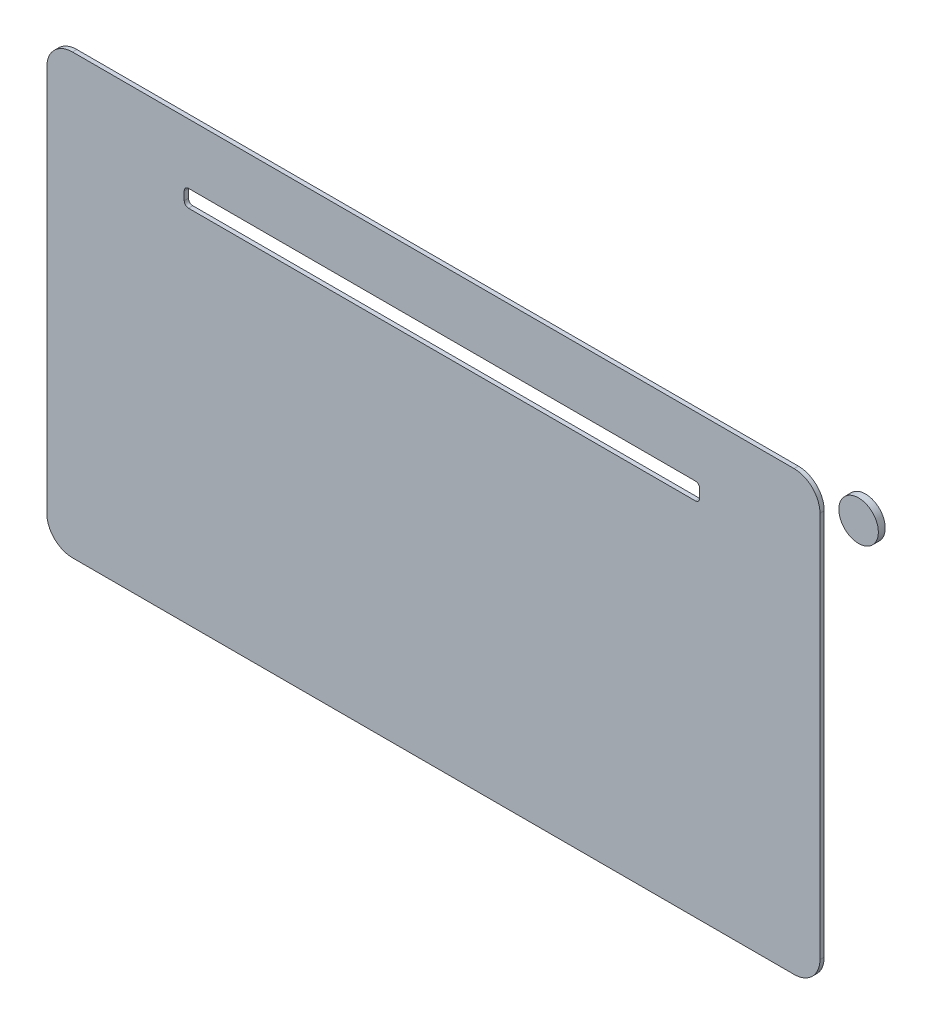
ISO-10303-21;
HEADER;
FILE_DESCRIPTION(('STEP AP214'),'2;1');
FILE_NAME('part.step','',(''),(''),'','','');
FILE_SCHEMA(('AUTOMOTIVE_DESIGN { 1 0 10303 214 1 1 1 1 }'));
ENDSEC;
DATA;
#1=APPLICATION_CONTEXT('core data for automotive mechanical design processes');
#2=APPLICATION_PROTOCOL_DEFINITION('international standard','automotive_design',2000,#1);
#3=PRODUCT_CONTEXT('',#1,'mechanical');
#4=PRODUCT('Part','Part','',(#3));
#5=PRODUCT_RELATED_PRODUCT_CATEGORY('part','',(#4));
#6=PRODUCT_DEFINITION_FORMATION('','',#4);
#7=PRODUCT_DEFINITION_CONTEXT('part definition',#1,'design');
#8=PRODUCT_DEFINITION('design','',#6,#7);
#9=PRODUCT_DEFINITION_SHAPE('','',#8);
#10=(LENGTH_UNIT() NAMED_UNIT(*) SI_UNIT(.MILLI.,.METRE.));
#11=(NAMED_UNIT(*) PLANE_ANGLE_UNIT() SI_UNIT($,.RADIAN.));
#12=(NAMED_UNIT(*) SI_UNIT($,.STERADIAN.) SOLID_ANGLE_UNIT());
#13=UNCERTAINTY_MEASURE_WITH_UNIT(LENGTH_MEASURE(1.E-05),#10,'distance_accuracy_value','');
#14=(GEOMETRIC_REPRESENTATION_CONTEXT(3) GLOBAL_UNCERTAINTY_ASSIGNED_CONTEXT((#13)) GLOBAL_UNIT_ASSIGNED_CONTEXT((#10,
#11,#12)) REPRESENTATION_CONTEXT('',''));
#15=CARTESIAN_POINT('',(0.,0.,0.));
#16=DIRECTION('',(0.,0.,1.));
#17=DIRECTION('',(1.,0.,0.));
#18=AXIS2_PLACEMENT_3D('',#15,#16,#17);
#19=CARTESIAN_POINT('',(132.5,61.5,0.));
#20=DIRECTION('',(0.,0.,-1.));
#21=DIRECTION('',(-1.,0.,0.));
#22=AXIS2_PLACEMENT_3D('',#19,#20,#21);
#23=CYLINDRICAL_SURFACE('',#22,2.3);
#24=CARTESIAN_POINT('',(132.5,61.5,0.));
#25=DIRECTION('',(0.,0.,1.));
#26=DIRECTION('',(1.,0.,0.));
#27=AXIS2_PLACEMENT_3D('',#24,#25,#26);
#28=CIRCLE('',#27,2.3);
#29=CARTESIAN_POINT('',(134.8,61.5,0.));
#30=VERTEX_POINT('',#29);
#31=EDGE_CURVE('E11',#30,#30,#28,.T.);
#32=ORIENTED_EDGE('',*,*,#31,.F.);
#33=EDGE_LOOP('',(#32));
#34=FACE_BOUND('',#33,.T.);
#35=CARTESIAN_POINT('',(132.5,61.5,-0.8));
#36=DIRECTION('',(0.,0.,1.));
#37=DIRECTION('',(1.,0.,0.));
#38=AXIS2_PLACEMENT_3D('',#35,#36,#37);
#39=CIRCLE('',#38,2.3);
#40=CARTESIAN_POINT('',(134.8,61.5,-0.8));
#41=VERTEX_POINT('',#40);
#42=EDGE_CURVE('E55',#41,#41,#39,.T.);
#43=ORIENTED_EDGE('',*,*,#42,.T.);
#44=EDGE_LOOP('',(#43));
#45=FACE_BOUND('',#44,.T.);
#46=ADVANCED_FACE('F47',(#34,#45),#23,.T.);
#47=CARTESIAN_POINT('',(132.5,61.5,0.));
#48=DIRECTION('',(0.,0.,1.));
#49=DIRECTION('',(1.,0.,0.));
#50=AXIS2_PLACEMENT_3D('',#47,#48,#49);
#51=PLANE('',#50);
#52=ORIENTED_EDGE('',*,*,#31,.T.);
#53=EDGE_LOOP('',(#52));
#54=FACE_BOUND('',#53,.T.);
#55=ADVANCED_FACE('F65',(#54),#51,.T.);
#56=CARTESIAN_POINT('',(132.5,61.5,-0.8));
#57=DIRECTION('',(0.,0.,1.));
#58=DIRECTION('',(1.,0.,0.));
#59=AXIS2_PLACEMENT_3D('',#56,#57,#58);
#60=PLANE('',#59);
#61=ORIENTED_EDGE('',*,*,#42,.F.);
#62=EDGE_LOOP('',(#61));
#63=FACE_BOUND('',#62,.T.);
#64=ADVANCED_FACE('F64',(#63),#60,.F.);
#65=CLOSED_SHELL('',(#46,#55,#64));
#66=MANIFOLD_SOLID_BREP('B2',#65);
#67=CARTESIAN_POINT('',(41.,15.,0.));
#68=DIRECTION('',(0.,0.,-1.));
#69=DIRECTION('',(-1.,0.,0.));
#70=AXIS2_PLACEMENT_3D('',#67,#68,#69);
#71=CYLINDRICAL_SURFACE('',#70,3.);
#72=CARTESIAN_POINT('',(41.,15.,-0.5));
#73=DIRECTION('',(0.,0.,1.));
#74=DIRECTION('',(1.,0.,0.));
#75=AXIS2_PLACEMENT_3D('',#72,#73,#74);
#76=CIRCLE('',#75,3.);
#77=CARTESIAN_POINT('',(38.,15.,-0.5));
#78=VERTEX_POINT('',#77);
#79=CARTESIAN_POINT('',(41.,12.,-0.5));
#80=VERTEX_POINT('',#79);
#81=EDGE_CURVE('E266',#78,#80,#76,.T.);
#82=ORIENTED_EDGE('',*,*,#81,.T.);
#83=DIRECTION('',(0.,0.,-1.));
#84=VECTOR('',#83,1.);
#85=CARTESIAN_POINT('',(41.,12.,0.));
#86=LINE('',#85,#84);
#87=CARTESIAN_POINT('',(41.,12.,0.));
#88=VERTEX_POINT('',#87);
#89=EDGE_CURVE('E50',#88,#80,#86,.T.);
#90=ORIENTED_EDGE('',*,*,#89,.F.);
#91=CARTESIAN_POINT('',(41.,15.,0.));
#92=DIRECTION('',(0.,0.,1.));
#93=DIRECTION('',(1.,0.,0.));
#94=AXIS2_PLACEMENT_3D('',#91,#92,#93);
#95=CIRCLE('',#94,3.);
#96=CARTESIAN_POINT('',(38.,15.,0.));
#97=VERTEX_POINT('',#96);
#98=EDGE_CURVE('E270',#97,#88,#95,.T.);
#99=ORIENTED_EDGE('',*,*,#98,.F.);
#100=DIRECTION('',(0.,0.,-1.));
#101=VECTOR('',#100,1.);
#102=CARTESIAN_POINT('',(38.,15.,0.));
#103=LINE('',#102,#101);
#104=EDGE_CURVE('E284',#97,#78,#103,.T.);
#105=ORIENTED_EDGE('',*,*,#104,.T.);
#106=EDGE_LOOP('',(#82,#90,#99,#105));
#107=FACE_BOUND('',#106,.T.);
#108=ADVANCED_FACE('F89',(#107),#71,.T.);
#109=CARTESIAN_POINT('',(41.,12.,0.));
#110=DIRECTION('',(0.,1.,0.));
#111=DIRECTION('',(0.,0.,1.));
#112=AXIS2_PLACEMENT_3D('',#109,#110,#111);
#113=PLANE('',#112);
#114=DIRECTION('',(1.,0.,0.));
#115=VECTOR('',#114,1.);
#116=CARTESIAN_POINT('',(41.,12.,-0.5));
#117=LINE('',#116,#115);
#118=CARTESIAN_POINT('',(125.,12.,-0.5));
#119=VERTEX_POINT('',#118);
#120=EDGE_CURVE('E287',#80,#119,#117,.T.);
#121=ORIENTED_EDGE('',*,*,#120,.T.);
#122=DIRECTION('',(0.,0.,-1.));
#123=VECTOR('',#122,1.);
#124=CARTESIAN_POINT('',(125.,12.,0.));
#125=LINE('',#124,#123);
#126=CARTESIAN_POINT('',(125.,12.,0.));
#127=VERTEX_POINT('',#126);
#128=EDGE_CURVE('E97',#127,#119,#125,.T.);
#129=ORIENTED_EDGE('',*,*,#128,.F.);
#130=DIRECTION('',(1.,0.,0.));
#131=VECTOR('',#130,1.);
#132=CARTESIAN_POINT('',(41.,12.,0.));
#133=LINE('',#132,#131);
#134=EDGE_CURVE('E269',#88,#127,#133,.T.);
#135=ORIENTED_EDGE('',*,*,#134,.F.);
#136=ORIENTED_EDGE('',*,*,#89,.T.);
#137=EDGE_LOOP('',(#121,#129,#135,#136));
#138=FACE_BOUND('',#137,.T.);
#139=ADVANCED_FACE('F342',(#138),#113,.F.);
#140=CARTESIAN_POINT('',(125.,15.,0.));
#141=DIRECTION('',(0.,0.,-1.));
#142=DIRECTION('',(-1.,0.,0.));
#143=AXIS2_PLACEMENT_3D('',#140,#141,#142);
#144=CYLINDRICAL_SURFACE('',#143,3.);
#145=CARTESIAN_POINT('',(125.,15.,-0.5));
#146=DIRECTION('',(0.,0.,1.));
#147=DIRECTION('',(1.,0.,0.));
#148=AXIS2_PLACEMENT_3D('',#145,#146,#147);
#149=CIRCLE('',#148,3.);
#150=CARTESIAN_POINT('',(128.,15.,-0.5));
#151=VERTEX_POINT('',#150);
#152=EDGE_CURVE('E289',#119,#151,#149,.T.);
#153=ORIENTED_EDGE('',*,*,#152,.T.);
#154=DIRECTION('',(0.,0.,-1.));
#155=VECTOR('',#154,1.);
#156=CARTESIAN_POINT('',(128.,15.,0.));
#157=LINE('',#156,#155);
#158=CARTESIAN_POINT('',(128.,15.,0.));
#159=VERTEX_POINT('',#158);
#160=EDGE_CURVE('E314',#159,#151,#157,.T.);
#161=ORIENTED_EDGE('',*,*,#160,.F.);
#162=CARTESIAN_POINT('',(125.,15.,0.));
#163=DIRECTION('',(0.,0.,1.));
#164=DIRECTION('',(1.,0.,0.));
#165=AXIS2_PLACEMENT_3D('',#162,#163,#164);
#166=CIRCLE('',#165,3.);
#167=EDGE_CURVE('E271',#127,#159,#166,.T.);
#168=ORIENTED_EDGE('',*,*,#167,.F.);
#169=ORIENTED_EDGE('',*,*,#128,.T.);
#170=EDGE_LOOP('',(#153,#161,#168,#169));
#171=FACE_BOUND('',#170,.T.);
#172=ADVANCED_FACE('F324',(#171),#144,.T.);
#173=CARTESIAN_POINT('',(128.,15.,0.));
#174=DIRECTION('',(-1.,0.,0.));
#175=DIRECTION('',(0.,0.,1.));
#176=AXIS2_PLACEMENT_3D('',#173,#174,#175);
#177=PLANE('',#176);
#178=DIRECTION('',(0.,1.,0.));
#179=VECTOR('',#178,1.);
#180=CARTESIAN_POINT('',(128.,15.,-0.5));
#181=LINE('',#180,#179);
#182=CARTESIAN_POINT('',(128.,60.,-0.5));
#183=VERTEX_POINT('',#182);
#184=EDGE_CURVE('E292',#151,#183,#181,.T.);
#185=ORIENTED_EDGE('',*,*,#184,.T.);
#186=DIRECTION('',(0.,0.,-1.));
#187=VECTOR('',#186,1.);
#188=CARTESIAN_POINT('',(128.,60.,0.));
#189=LINE('',#188,#187);
#190=CARTESIAN_POINT('',(128.,60.,0.));
#191=VERTEX_POINT('',#190);
#192=EDGE_CURVE('E315',#191,#183,#189,.T.);
#193=ORIENTED_EDGE('',*,*,#192,.F.);
#194=DIRECTION('',(0.,1.,0.));
#195=VECTOR('',#194,1.);
#196=CARTESIAN_POINT('',(128.,15.,0.));
#197=LINE('',#196,#195);
#198=EDGE_CURVE('E273',#159,#191,#197,.T.);
#199=ORIENTED_EDGE('',*,*,#198,.F.);
#200=ORIENTED_EDGE('',*,*,#160,.T.);
#201=EDGE_LOOP('',(#185,#193,#199,#200));
#202=FACE_BOUND('',#201,.T.);
#203=ADVANCED_FACE('F331',(#202),#177,.F.);
#204=CARTESIAN_POINT('',(125.,60.,0.));
#205=DIRECTION('',(0.,0.,-1.));
#206=DIRECTION('',(-1.,0.,0.));
#207=AXIS2_PLACEMENT_3D('',#204,#205,#206);
#208=CYLINDRICAL_SURFACE('',#207,3.);
#209=CARTESIAN_POINT('',(125.,60.,-0.5));
#210=DIRECTION('',(0.,0.,1.));
#211=DIRECTION('',(1.,0.,0.));
#212=AXIS2_PLACEMENT_3D('',#209,#210,#211);
#213=CIRCLE('',#212,3.);
#214=CARTESIAN_POINT('',(125.,63.,-0.5));
#215=VERTEX_POINT('',#214);
#216=EDGE_CURVE('E295',#183,#215,#213,.T.);
#217=ORIENTED_EDGE('',*,*,#216,.T.);
#218=DIRECTION('',(0.,0.,-1.));
#219=VECTOR('',#218,1.);
#220=CARTESIAN_POINT('',(125.,63.,0.));
#221=LINE('',#220,#219);
#222=CARTESIAN_POINT('',(125.,63.,0.));
#223=VERTEX_POINT('',#222);
#224=EDGE_CURVE('E307',#223,#215,#221,.T.);
#225=ORIENTED_EDGE('',*,*,#224,.F.);
#226=CARTESIAN_POINT('',(125.,60.,0.));
#227=DIRECTION('',(0.,0.,1.));
#228=DIRECTION('',(1.,0.,0.));
#229=AXIS2_PLACEMENT_3D('',#226,#227,#228);
#230=CIRCLE('',#229,3.);
#231=EDGE_CURVE('E279',#191,#223,#230,.T.);
#232=ORIENTED_EDGE('',*,*,#231,.F.);
#233=ORIENTED_EDGE('',*,*,#192,.T.);
#234=EDGE_LOOP('',(#217,#225,#232,#233));
#235=FACE_BOUND('',#234,.T.);
#236=ADVANCED_FACE('F334',(#235),#208,.T.);
#237=CARTESIAN_POINT('',(125.,63.,0.));
#238=DIRECTION('',(0.,-1.,0.));
#239=DIRECTION('',(0.,0.,-1.));
#240=AXIS2_PLACEMENT_3D('',#237,#238,#239);
#241=PLANE('',#240);
#242=DIRECTION('',(-1.,0.,0.));
#243=VECTOR('',#242,1.);
#244=CARTESIAN_POINT('',(125.,63.,-0.5));
#245=LINE('',#244,#243);
#246=CARTESIAN_POINT('',(41.,63.,-0.5));
#247=VERTEX_POINT('',#246);
#248=EDGE_CURVE('E298',#215,#247,#245,.T.);
#249=ORIENTED_EDGE('',*,*,#248,.T.);
#250=DIRECTION('',(0.,0.,-1.));
#251=VECTOR('',#250,1.);
#252=CARTESIAN_POINT('',(41.,63.,0.));
#253=LINE('',#252,#251);
#254=CARTESIAN_POINT('',(41.,63.,0.));
#255=VERTEX_POINT('',#254);
#256=EDGE_CURVE('E306',#255,#247,#253,.T.);
#257=ORIENTED_EDGE('',*,*,#256,.F.);
#258=DIRECTION('',(-1.,0.,0.));
#259=VECTOR('',#258,1.);
#260=CARTESIAN_POINT('',(125.,63.,0.));
#261=LINE('',#260,#259);
#262=EDGE_CURVE('E280',#223,#255,#261,.T.);
#263=ORIENTED_EDGE('',*,*,#262,.F.);
#264=ORIENTED_EDGE('',*,*,#224,.T.);
#265=EDGE_LOOP('',(#249,#257,#263,#264));
#266=FACE_BOUND('',#265,.T.);
#267=ADVANCED_FACE('F358',(#266),#241,.F.);
#268=CARTESIAN_POINT('',(41.,60.,0.));
#269=DIRECTION('',(0.,0.,-1.));
#270=DIRECTION('',(-1.,0.,0.));
#271=AXIS2_PLACEMENT_3D('',#268,#269,#270);
#272=CYLINDRICAL_SURFACE('',#271,3.);
#273=CARTESIAN_POINT('',(41.,60.,-0.5));
#274=DIRECTION('',(0.,0.,1.));
#275=DIRECTION('',(1.,0.,0.));
#276=AXIS2_PLACEMENT_3D('',#273,#274,#275);
#277=CIRCLE('',#276,3.);
#278=CARTESIAN_POINT('',(38.,60.,-0.5));
#279=VERTEX_POINT('',#278);
#280=EDGE_CURVE('E296',#247,#279,#277,.T.);
#281=ORIENTED_EDGE('',*,*,#280,.T.);
#282=DIRECTION('',(0.,0.,-1.));
#283=VECTOR('',#282,1.);
#284=CARTESIAN_POINT('',(38.,60.,0.));
#285=LINE('',#284,#283);
#286=CARTESIAN_POINT('',(38.,60.,0.));
#287=VERTEX_POINT('',#286);
#288=EDGE_CURVE('E303',#287,#279,#285,.T.);
#289=ORIENTED_EDGE('',*,*,#288,.F.);
#290=CARTESIAN_POINT('',(41.,60.,0.));
#291=DIRECTION('',(0.,0.,1.));
#292=DIRECTION('',(1.,0.,0.));
#293=AXIS2_PLACEMENT_3D('',#290,#291,#292);
#294=CIRCLE('',#293,3.);
#295=EDGE_CURVE('E283',#255,#287,#294,.T.);
#296=ORIENTED_EDGE('',*,*,#295,.F.);
#297=ORIENTED_EDGE('',*,*,#256,.T.);
#298=EDGE_LOOP('',(#281,#289,#296,#297));
#299=FACE_BOUND('',#298,.T.);
#300=ADVANCED_FACE('F353',(#299),#272,.T.);
#301=CARTESIAN_POINT('',(38.,60.,0.));
#302=DIRECTION('',(1.,0.,0.));
#303=DIRECTION('',(0.,0.,-1.));
#304=AXIS2_PLACEMENT_3D('',#301,#302,#303);
#305=PLANE('',#304);
#306=DIRECTION('',(0.,-1.,0.));
#307=VECTOR('',#306,1.);
#308=CARTESIAN_POINT('',(38.,60.,-0.5));
#309=LINE('',#308,#307);
#310=EDGE_CURVE('E272',#279,#78,#309,.T.);
#311=ORIENTED_EDGE('',*,*,#310,.T.);
#312=ORIENTED_EDGE('',*,*,#104,.F.);
#313=DIRECTION('',(0.,-1.,0.));
#314=VECTOR('',#313,1.);
#315=CARTESIAN_POINT('',(38.,60.,0.));
#316=LINE('',#315,#314);
#317=EDGE_CURVE('E281',#287,#97,#316,.T.);
#318=ORIENTED_EDGE('',*,*,#317,.F.);
#319=ORIENTED_EDGE('',*,*,#288,.T.);
#320=EDGE_LOOP('',(#311,#312,#318,#319));
#321=FACE_BOUND('',#320,.T.);
#322=ADVANCED_FACE('F347',(#321),#305,.F.);
#323=CARTESIAN_POINT('',(41.,15.,0.));
#324=DIRECTION('',(0.,0.,1.));
#325=DIRECTION('',(1.,0.,0.));
#326=AXIS2_PLACEMENT_3D('',#323,#324,#325);
#327=PLANE('',#326);
#328=CARTESIAN_POINT('',(113.5,54.5,0.));
#329=DIRECTION('',(0.,0.,1.));
#330=DIRECTION('',(1.,0.,0.));
#331=AXIS2_PLACEMENT_3D('',#328,#329,#330);
#332=CIRCLE('',#331,0.5);
#333=CARTESIAN_POINT('',(113.5,54.,0.));
#334=VERTEX_POINT('',#333);
#335=CARTESIAN_POINT('',(114.,54.5,0.));
#336=VERTEX_POINT('',#335);
#337=EDGE_CURVE('E262',#334,#336,#332,.T.);
#338=ORIENTED_EDGE('',*,*,#337,.F.);
#339=DIRECTION('',(1.,0.,0.));
#340=VECTOR('',#339,1.);
#341=CARTESIAN_POINT('',(41.,54.,0.));
#342=LINE('',#341,#340);
#343=CARTESIAN_POINT('',(54.5,54.,0.));
#344=VERTEX_POINT('',#343);
#345=EDGE_CURVE('E241',#344,#334,#342,.T.);
#346=ORIENTED_EDGE('',*,*,#345,.F.);
#347=CARTESIAN_POINT('',(54.5,54.5,0.));
#348=DIRECTION('',(0.,0.,1.));
#349=DIRECTION('',(1.,0.,0.));
#350=AXIS2_PLACEMENT_3D('',#347,#348,#349);
#351=CIRCLE('',#350,0.5);
#352=CARTESIAN_POINT('',(54.,54.5,0.));
#353=VERTEX_POINT('',#352);
#354=EDGE_CURVE('E206',#353,#344,#351,.T.);
#355=ORIENTED_EDGE('',*,*,#354,.F.);
#356=DIRECTION('',(0.,-1.,0.));
#357=VECTOR('',#356,1.);
#358=CARTESIAN_POINT('',(54.,15.,0.));
#359=LINE('',#358,#357);
#360=CARTESIAN_POINT('',(54.,55.5,0.));
#361=VERTEX_POINT('',#360);
#362=EDGE_CURVE('E251',#361,#353,#359,.T.);
#363=ORIENTED_EDGE('',*,*,#362,.F.);
#364=CARTESIAN_POINT('',(54.5,55.5,0.));
#365=DIRECTION('',(0.,0.,1.));
#366=DIRECTION('',(1.,0.,0.));
#367=AXIS2_PLACEMENT_3D('',#364,#365,#366);
#368=CIRCLE('',#367,0.5);
#369=CARTESIAN_POINT('',(54.5,56.,0.));
#370=VERTEX_POINT('',#369);
#371=EDGE_CURVE('E258',#370,#361,#368,.T.);
#372=ORIENTED_EDGE('',*,*,#371,.F.);
#373=DIRECTION('',(-1.,0.,0.));
#374=VECTOR('',#373,1.);
#375=CARTESIAN_POINT('',(41.,56.,0.));
#376=LINE('',#375,#374);
#377=CARTESIAN_POINT('',(113.5,56.,0.));
#378=VERTEX_POINT('',#377);
#379=EDGE_CURVE('E257',#378,#370,#376,.T.);
#380=ORIENTED_EDGE('',*,*,#379,.F.);
#381=CARTESIAN_POINT('',(113.5,55.5,0.));
#382=DIRECTION('',(0.,0.,1.));
#383=DIRECTION('',(1.,0.,0.));
#384=AXIS2_PLACEMENT_3D('',#381,#382,#383);
#385=CIRCLE('',#384,0.5);
#386=CARTESIAN_POINT('',(114.,55.5,0.));
#387=VERTEX_POINT('',#386);
#388=EDGE_CURVE('E256',#387,#378,#385,.T.);
#389=ORIENTED_EDGE('',*,*,#388,.F.);
#390=DIRECTION('',(0.,1.,0.));
#391=VECTOR('',#390,1.);
#392=CARTESIAN_POINT('',(114.,15.,0.));
#393=LINE('',#392,#391);
#394=EDGE_CURVE('E265',#336,#387,#393,.T.);
#395=ORIENTED_EDGE('',*,*,#394,.F.);
#396=EDGE_LOOP('',(#338,#346,#355,#363,#372,#380,#389,#395));
#397=FACE_BOUND('',#396,.T.);
#398=ORIENTED_EDGE('',*,*,#98,.T.);
#399=ORIENTED_EDGE('',*,*,#134,.T.);
#400=ORIENTED_EDGE('',*,*,#167,.T.);
#401=ORIENTED_EDGE('',*,*,#198,.T.);
#402=ORIENTED_EDGE('',*,*,#231,.T.);
#403=ORIENTED_EDGE('',*,*,#262,.T.);
#404=ORIENTED_EDGE('',*,*,#295,.T.);
#405=ORIENTED_EDGE('',*,*,#317,.T.);
#406=EDGE_LOOP('',(#398,#399,#400,#401,#402,#403,#404,#405));
#407=FACE_BOUND('',#406,.T.);
#408=ADVANCED_FACE('F339',(#397,#407),#327,.T.);
#409=CARTESIAN_POINT('',(41.,15.,-0.5));
#410=DIRECTION('',(0.,0.,1.));
#411=DIRECTION('',(1.,0.,0.));
#412=AXIS2_PLACEMENT_3D('',#409,#410,#411);
#413=PLANE('',#412);
#414=DIRECTION('',(-1.,0.,0.));
#415=VECTOR('',#414,1.);
#416=CARTESIAN_POINT('',(113.5,54.,-0.5));
#417=LINE('',#416,#415);
#418=CARTESIAN_POINT('',(113.5,54.,-0.5));
#419=VERTEX_POINT('',#418);
#420=CARTESIAN_POINT('',(54.5,54.,-0.5));
#421=VERTEX_POINT('',#420);
#422=EDGE_CURVE('E215',#419,#421,#417,.T.);
#423=ORIENTED_EDGE('',*,*,#422,.F.);
#424=CARTESIAN_POINT('',(113.5,54.5,-0.5));
#425=DIRECTION('',(0.,0.,-1.));
#426=DIRECTION('',(-1.,0.,0.));
#427=AXIS2_PLACEMENT_3D('',#424,#425,#426);
#428=CIRCLE('',#427,0.5);
#429=CARTESIAN_POINT('',(114.,54.5,-0.5));
#430=VERTEX_POINT('',#429);
#431=EDGE_CURVE('E115',#430,#419,#428,.T.);
#432=ORIENTED_EDGE('',*,*,#431,.F.);
#433=DIRECTION('',(0.,-1.,0.));
#434=VECTOR('',#433,1.);
#435=CARTESIAN_POINT('',(114.,55.5,-0.5));
#436=LINE('',#435,#434);
#437=CARTESIAN_POINT('',(114.,55.5,-0.5));
#438=VERTEX_POINT('',#437);
#439=EDGE_CURVE('E236',#438,#430,#436,.T.);
#440=ORIENTED_EDGE('',*,*,#439,.F.);
#441=CARTESIAN_POINT('',(113.5,55.5,-0.5));
#442=DIRECTION('',(0.,0.,-1.));
#443=DIRECTION('',(-1.,0.,0.));
#444=AXIS2_PLACEMENT_3D('',#441,#442,#443);
#445=CIRCLE('',#444,0.5);
#446=CARTESIAN_POINT('',(113.5,56.,-0.5));
#447=VERTEX_POINT('',#446);
#448=EDGE_CURVE('E231',#447,#438,#445,.T.);
#449=ORIENTED_EDGE('',*,*,#448,.F.);
#450=DIRECTION('',(1.,0.,0.));
#451=VECTOR('',#450,1.);
#452=CARTESIAN_POINT('',(54.5,56.,-0.5));
#453=LINE('',#452,#451);
#454=CARTESIAN_POINT('',(54.5,56.,-0.5));
#455=VERTEX_POINT('',#454);
#456=EDGE_CURVE('E229',#455,#447,#453,.T.);
#457=ORIENTED_EDGE('',*,*,#456,.F.);
#458=CARTESIAN_POINT('',(54.5,55.5,-0.5));
#459=DIRECTION('',(0.,0.,-1.));
#460=DIRECTION('',(-1.,0.,0.));
#461=AXIS2_PLACEMENT_3D('',#458,#459,#460);
#462=CIRCLE('',#461,0.5);
#463=CARTESIAN_POINT('',(54.,55.5,-0.5));
#464=VERTEX_POINT('',#463);
#465=EDGE_CURVE('E223',#464,#455,#462,.T.);
#466=ORIENTED_EDGE('',*,*,#465,.F.);
#467=DIRECTION('',(0.,1.,0.));
#468=VECTOR('',#467,1.);
#469=CARTESIAN_POINT('',(54.,54.5,-0.5));
#470=LINE('',#469,#468);
#471=CARTESIAN_POINT('',(54.,54.5,-0.5));
#472=VERTEX_POINT('',#471);
#473=EDGE_CURVE('E225',#472,#464,#470,.T.);
#474=ORIENTED_EDGE('',*,*,#473,.F.);
#475=CARTESIAN_POINT('',(54.5,54.5,-0.5));
#476=DIRECTION('',(0.,0.,-1.));
#477=DIRECTION('',(-1.,0.,0.));
#478=AXIS2_PLACEMENT_3D('',#475,#476,#477);
#479=CIRCLE('',#478,0.5);
#480=EDGE_CURVE('E204',#421,#472,#479,.T.);
#481=ORIENTED_EDGE('',*,*,#480,.F.);
#482=EDGE_LOOP('',(#423,#432,#440,#449,#457,#466,#474,#481));
#483=FACE_BOUND('',#482,.T.);
#484=ORIENTED_EDGE('',*,*,#81,.F.);
#485=ORIENTED_EDGE('',*,*,#310,.F.);
#486=ORIENTED_EDGE('',*,*,#280,.F.);
#487=ORIENTED_EDGE('',*,*,#248,.F.);
#488=ORIENTED_EDGE('',*,*,#216,.F.);
#489=ORIENTED_EDGE('',*,*,#184,.F.);
#490=ORIENTED_EDGE('',*,*,#152,.F.);
#491=ORIENTED_EDGE('',*,*,#120,.F.);
#492=EDGE_LOOP('',(#484,#485,#486,#487,#488,#489,#490,#491));
#493=FACE_BOUND('',#492,.T.);
#494=ADVANCED_FACE('F216',(#483,#493),#413,.F.);
#495=CARTESIAN_POINT('',(113.5,54.5,0.5));
#496=DIRECTION('',(0.,0.,-1.));
#497=DIRECTION('',(-1.,0.,0.));
#498=AXIS2_PLACEMENT_3D('',#495,#496,#497);
#499=CYLINDRICAL_SURFACE('',#498,0.5);
#500=ORIENTED_EDGE('',*,*,#337,.T.);
#501=DIRECTION('',(0.,0.,-1.));
#502=VECTOR('',#501,1.);
#503=CARTESIAN_POINT('',(114.,54.5,0.5));
#504=LINE('',#503,#502);
#505=EDGE_CURVE('E237',#336,#430,#504,.T.);
#506=ORIENTED_EDGE('',*,*,#505,.T.);
#507=ORIENTED_EDGE('',*,*,#431,.T.);
#508=DIRECTION('',(0.,0.,-1.));
#509=VECTOR('',#508,1.);
#510=CARTESIAN_POINT('',(113.5,54.,0.5));
#511=LINE('',#510,#509);
#512=EDGE_CURVE('E213',#334,#419,#511,.T.);
#513=ORIENTED_EDGE('',*,*,#512,.F.);
#514=EDGE_LOOP('',(#500,#506,#507,#513));
#515=FACE_BOUND('',#514,.T.);
#516=ADVANCED_FACE('F423',(#515),#499,.F.);
#517=CARTESIAN_POINT('',(114.,55.5,0.5));
#518=DIRECTION('',(1.,0.,0.));
#519=DIRECTION('',(0.,0.,-1.));
#520=AXIS2_PLACEMENT_3D('',#517,#518,#519);
#521=PLANE('',#520);
#522=ORIENTED_EDGE('',*,*,#394,.T.);
#523=DIRECTION('',(0.,0.,-1.));
#524=VECTOR('',#523,1.);
#525=CARTESIAN_POINT('',(114.,55.5,0.5));
#526=LINE('',#525,#524);
#527=EDGE_CURVE('E245',#387,#438,#526,.T.);
#528=ORIENTED_EDGE('',*,*,#527,.T.);
#529=ORIENTED_EDGE('',*,*,#439,.T.);
#530=ORIENTED_EDGE('',*,*,#505,.F.);
#531=EDGE_LOOP('',(#522,#528,#529,#530));
#532=FACE_BOUND('',#531,.T.);
#533=ADVANCED_FACE('F427',(#532),#521,.F.);
#534=CARTESIAN_POINT('',(113.5,55.5,0.5));
#535=DIRECTION('',(0.,0.,-1.));
#536=DIRECTION('',(-1.,0.,0.));
#537=AXIS2_PLACEMENT_3D('',#534,#535,#536);
#538=CYLINDRICAL_SURFACE('',#537,0.5);
#539=ORIENTED_EDGE('',*,*,#388,.T.);
#540=DIRECTION('',(0.,0.,-1.));
#541=VECTOR('',#540,1.);
#542=CARTESIAN_POINT('',(113.5,56.,0.5));
#543=LINE('',#542,#541);
#544=EDGE_CURVE('E242',#378,#447,#543,.T.);
#545=ORIENTED_EDGE('',*,*,#544,.T.);
#546=ORIENTED_EDGE('',*,*,#448,.T.);
#547=ORIENTED_EDGE('',*,*,#527,.F.);
#548=EDGE_LOOP('',(#539,#545,#546,#547));
#549=FACE_BOUND('',#548,.T.);
#550=ADVANCED_FACE('F437',(#549),#538,.F.);
#551=CARTESIAN_POINT('',(54.5,56.,0.5));
#552=DIRECTION('',(0.,1.,0.));
#553=DIRECTION('',(0.,0.,1.));
#554=AXIS2_PLACEMENT_3D('',#551,#552,#553);
#555=PLANE('',#554);
#556=ORIENTED_EDGE('',*,*,#379,.T.);
#557=DIRECTION('',(0.,0.,-1.));
#558=VECTOR('',#557,1.);
#559=CARTESIAN_POINT('',(54.5,56.,0.5));
#560=LINE('',#559,#558);
#561=EDGE_CURVE('E246',#370,#455,#560,.T.);
#562=ORIENTED_EDGE('',*,*,#561,.T.);
#563=ORIENTED_EDGE('',*,*,#456,.T.);
#564=ORIENTED_EDGE('',*,*,#544,.F.);
#565=EDGE_LOOP('',(#556,#562,#563,#564));
#566=FACE_BOUND('',#565,.T.);
#567=ADVANCED_FACE('F446',(#566),#555,.F.);
#568=CARTESIAN_POINT('',(54.5,55.5,0.5));
#569=DIRECTION('',(0.,0.,-1.));
#570=DIRECTION('',(-1.,0.,0.));
#571=AXIS2_PLACEMENT_3D('',#568,#569,#570);
#572=CYLINDRICAL_SURFACE('',#571,0.5);
#573=ORIENTED_EDGE('',*,*,#371,.T.);
#574=DIRECTION('',(0.,0.,-1.));
#575=VECTOR('',#574,1.);
#576=CARTESIAN_POINT('',(54.,55.5,0.5));
#577=LINE('',#576,#575);
#578=EDGE_CURVE('E247',#361,#464,#577,.T.);
#579=ORIENTED_EDGE('',*,*,#578,.T.);
#580=ORIENTED_EDGE('',*,*,#465,.T.);
#581=ORIENTED_EDGE('',*,*,#561,.F.);
#582=EDGE_LOOP('',(#573,#579,#580,#581));
#583=FACE_BOUND('',#582,.T.);
#584=ADVANCED_FACE('F457',(#583),#572,.F.);
#585=CARTESIAN_POINT('',(54.,54.5,0.5));
#586=DIRECTION('',(-1.,0.,0.));
#587=DIRECTION('',(0.,0.,1.));
#588=AXIS2_PLACEMENT_3D('',#585,#586,#587);
#589=PLANE('',#588);
#590=ORIENTED_EDGE('',*,*,#362,.T.);
#591=DIRECTION('',(0.,0.,-1.));
#592=VECTOR('',#591,1.);
#593=CARTESIAN_POINT('',(54.,54.5,0.5));
#594=LINE('',#593,#592);
#595=EDGE_CURVE('E208',#353,#472,#594,.T.);
#596=ORIENTED_EDGE('',*,*,#595,.T.);
#597=ORIENTED_EDGE('',*,*,#473,.T.);
#598=ORIENTED_EDGE('',*,*,#578,.F.);
#599=EDGE_LOOP('',(#590,#596,#597,#598));
#600=FACE_BOUND('',#599,.T.);
#601=ADVANCED_FACE('F469',(#600),#589,.F.);
#602=CARTESIAN_POINT('',(54.5,54.5,0.5));
#603=DIRECTION('',(0.,0.,-1.));
#604=DIRECTION('',(-1.,0.,0.));
#605=AXIS2_PLACEMENT_3D('',#602,#603,#604);
#606=CYLINDRICAL_SURFACE('',#605,0.5);
#607=ORIENTED_EDGE('',*,*,#354,.T.);
#608=DIRECTION('',(0.,0.,-1.));
#609=VECTOR('',#608,1.);
#610=CARTESIAN_POINT('',(54.5,54.,0.5));
#611=LINE('',#610,#609);
#612=EDGE_CURVE('E104',#344,#421,#611,.T.);
#613=ORIENTED_EDGE('',*,*,#612,.T.);
#614=ORIENTED_EDGE('',*,*,#480,.T.);
#615=ORIENTED_EDGE('',*,*,#595,.F.);
#616=EDGE_LOOP('',(#607,#613,#614,#615));
#617=FACE_BOUND('',#616,.T.);
#618=ADVANCED_FACE('F205',(#617),#606,.F.);
#619=CARTESIAN_POINT('',(113.5,54.,0.5));
#620=DIRECTION('',(0.,-1.,0.));
#621=DIRECTION('',(0.,0.,-1.));
#622=AXIS2_PLACEMENT_3D('',#619,#620,#621);
#623=PLANE('',#622);
#624=ORIENTED_EDGE('',*,*,#345,.T.);
#625=ORIENTED_EDGE('',*,*,#512,.T.);
#626=ORIENTED_EDGE('',*,*,#422,.T.);
#627=ORIENTED_EDGE('',*,*,#612,.F.);
#628=EDGE_LOOP('',(#624,#625,#626,#627));
#629=FACE_BOUND('',#628,.T.);
#630=ADVANCED_FACE('F211',(#629),#623,.F.);
#631=CLOSED_SHELL('',(#108,#139,#172,#203,#236,#267,#300,#322,#408,#494,#516,#533,#550,#567,
#584,#601,#618,#630));
#632=MANIFOLD_SOLID_BREP('B6',#631);
#633=ADVANCED_BREP_SHAPE_REPRESENTATION('',(#18,#66,#632),#14);
#634=SHAPE_DEFINITION_REPRESENTATION(#9,#633);
ENDSEC;
END-ISO-10303-21;
